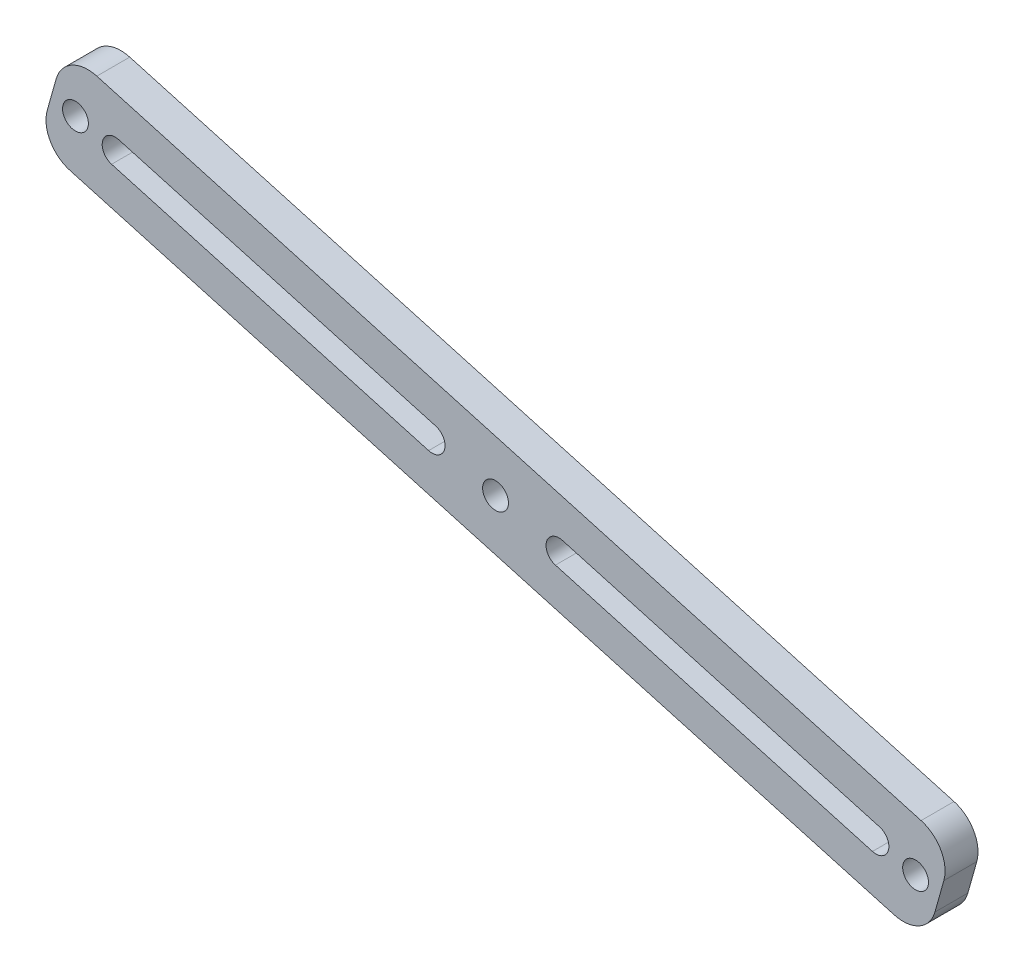
ISO-10303-21;
HEADER;
FILE_DESCRIPTION(('STEP AP214'),'2;1');
FILE_NAME('part.step','',(''),(''),'','','');
FILE_SCHEMA(('AUTOMOTIVE_DESIGN { 1 0 10303 214 1 1 1 1 }'));
ENDSEC;
DATA;
#1=APPLICATION_CONTEXT('core data for automotive mechanical design processes');
#2=APPLICATION_PROTOCOL_DEFINITION('international standard','automotive_design',2000,#1);
#3=PRODUCT_CONTEXT('',#1,'mechanical');
#4=PRODUCT('Part','Part','',(#3));
#5=PRODUCT_RELATED_PRODUCT_CATEGORY('part','',(#4));
#6=PRODUCT_DEFINITION_FORMATION('','',#4);
#7=PRODUCT_DEFINITION_CONTEXT('part definition',#1,'design');
#8=PRODUCT_DEFINITION('design','',#6,#7);
#9=PRODUCT_DEFINITION_SHAPE('','',#8);
#10=(LENGTH_UNIT() NAMED_UNIT(*) SI_UNIT(.MILLI.,.METRE.));
#11=(NAMED_UNIT(*) PLANE_ANGLE_UNIT() SI_UNIT($,.RADIAN.));
#12=(NAMED_UNIT(*) SI_UNIT($,.STERADIAN.) SOLID_ANGLE_UNIT());
#13=UNCERTAINTY_MEASURE_WITH_UNIT(LENGTH_MEASURE(1.E-05),#10,'distance_accuracy_value','');
#14=(GEOMETRIC_REPRESENTATION_CONTEXT(3) GLOBAL_UNCERTAINTY_ASSIGNED_CONTEXT((#13)) GLOBAL_UNIT_ASSIGNED_CONTEXT((#10,
#11,#12)) REPRESENTATION_CONTEXT('',''));
#15=CARTESIAN_POINT('',(0.,0.,0.));
#16=DIRECTION('',(0.,0.,1.));
#17=DIRECTION('',(1.,0.,0.));
#18=AXIS2_PLACEMENT_3D('',#15,#16,#17);
#19=CARTESIAN_POINT('',(156.907108006918,556.114291042661,6.35));
#20=DIRECTION('',(-0.271547306889594,-0.962425093251942,0.));
#21=DIRECTION('',(0.962425093251942,-0.271547306889594,0.));
#22=AXIS2_PLACEMENT_3D('',#19,#20,#21);
#23=PLANE('',#22);
#24=DIRECTION('',(-0.962425093251942,0.271547306889594,0.));
#25=VECTOR('',#24,1.);
#26=CARTESIAN_POINT('',(156.907108006918,556.114291042661,0.));
#27=LINE('',#26,#25);
#28=CARTESIAN_POINT('',(565.111539008492,440.93980663231,0.));
#29=VERTEX_POINT('',#28);
#30=CARTESIAN_POINT('',(406.215156112596,485.772266999782,0.));
#31=VERTEX_POINT('',#30);
#32=EDGE_CURVE('E230',#29,#31,#27,.T.);
#33=ORIENTED_EDGE('',*,*,#32,.F.);
#34=DIRECTION('',(0.,0.,-1.));
#35=VECTOR('',#34,1.);
#36=CARTESIAN_POINT('',(565.111539008492,440.93980663231,6.35));
#37=LINE('',#36,#35);
#38=CARTESIAN_POINT('',(565.111539008492,440.93980663231,6.35));
#39=VERTEX_POINT('',#38);
#40=EDGE_CURVE('E11',#29,#39,#37,.F.);
#41=ORIENTED_EDGE('',*,*,#40,.T.);
#42=DIRECTION('',(-0.962425093251942,0.271547306889594,0.));
#43=VECTOR('',#42,1.);
#44=CARTESIAN_POINT('',(156.907108006918,556.114291042661,6.35));
#45=LINE('',#44,#43);
#46=CARTESIAN_POINT('',(406.215156112596,485.772266999782,6.35));
#47=VERTEX_POINT('',#46);
#48=EDGE_CURVE('E196',#39,#47,#45,.T.);
#49=ORIENTED_EDGE('',*,*,#48,.T.);
#50=DIRECTION('',(0.,0.,-1.));
#51=VECTOR('',#50,1.);
#52=CARTESIAN_POINT('',(406.215156112596,485.772266999782,6.35));
#53=LINE('',#52,#51);
#54=EDGE_CURVE('E47',#47,#31,#53,.T.);
#55=ORIENTED_EDGE('',*,*,#54,.T.);
#56=EDGE_LOOP('',(#33,#41,#49,#55));
#57=FACE_BOUND('',#56,.T.);
#58=ADVANCED_FACE('F39',(#57),#23,.T.);
#59=CARTESIAN_POINT('',(414.315830343723,-116.8988098091,6.35));
#60=DIRECTION('',(-0.962425093251941,0.271547306889595,0.));
#61=DIRECTION('',(-0.271547306889595,-0.962425093251942,0.));
#62=AXIS2_PLACEMENT_3D('',#59,#60,#61);
#63=PLANE('',#62);
#64=DIRECTION('',(0.271547306889595,0.962425093251942,0.));
#65=VECTOR('',#64,1.);
#66=CARTESIAN_POINT('',(414.315830343723,-116.8988098091,0.));
#67=LINE('',#66,#65);
#68=CARTESIAN_POINT('',(572.947263749391,445.326880575711,0.));
#69=VERTEX_POINT('',#68);
#70=CARTESIAN_POINT('',(574.67158914814,451.438279917861,0.));
#71=VERTEX_POINT('',#70);
#72=EDGE_CURVE('E233',#69,#71,#67,.T.);
#73=ORIENTED_EDGE('',*,*,#72,.T.);
#74=DIRECTION('',(0.,0.,-1.));
#75=VECTOR('',#74,1.);
#76=CARTESIAN_POINT('',(574.671589148139,451.438279917861,6.35));
#77=LINE('',#76,#75);
#78=CARTESIAN_POINT('',(574.67158914814,451.438279917861,6.35));
#79=VERTEX_POINT('',#78);
#80=EDGE_CURVE('E54',#71,#79,#77,.F.);
#81=ORIENTED_EDGE('',*,*,#80,.T.);
#82=DIRECTION('',(0.271547306889595,0.962425093251942,0.));
#83=VECTOR('',#82,1.);
#84=CARTESIAN_POINT('',(414.315830343723,-116.8988098091,6.35));
#85=LINE('',#84,#83);
#86=CARTESIAN_POINT('',(572.947263749391,445.326880575711,6.35));
#87=VERTEX_POINT('',#86);
#88=EDGE_CURVE('E199',#87,#79,#85,.T.);
#89=ORIENTED_EDGE('',*,*,#88,.F.);
#90=DIRECTION('',(0.,0.,-1.));
#91=VECTOR('',#90,1.);
#92=CARTESIAN_POINT('',(572.947263749391,445.326880575711,0.));
#93=LINE('',#92,#91);
#94=EDGE_CURVE('E276',#87,#69,#93,.T.);
#95=ORIENTED_EDGE('',*,*,#94,.T.);
#96=EDGE_LOOP('',(#73,#81,#89,#95));
#97=FACE_BOUND('',#96,.T.);
#98=ADVANCED_FACE('F293',(#97),#63,.F.);
#99=CARTESIAN_POINT('',(162.080084203158,574.448489069109,6.35));
#100=DIRECTION('',(0.271547306889585,0.962425093251944,0.));
#101=DIRECTION('',(-0.962425093251944,0.271547306889585,0.));
#102=AXIS2_PLACEMENT_3D('',#99,#100,#101);
#103=PLANE('',#102);
#104=DIRECTION('',(0.962425093251944,-0.271547306889585,0.));
#105=VECTOR('',#104,1.);
#106=CARTESIAN_POINT('',(162.080084203158,574.448489069109,0.));
#107=LINE('',#106,#105);
#108=CARTESIAN_POINT('',(411.388132308842,504.10646502623,0.));
#109=VERTEX_POINT('',#108);
#110=CARTESIAN_POINT('',(570.284515204738,459.27400465876,0.));
#111=VERTEX_POINT('',#110);
#112=EDGE_CURVE('E235',#109,#111,#107,.T.);
#113=ORIENTED_EDGE('',*,*,#112,.F.);
#114=DIRECTION('',(0.,0.,-1.));
#115=VECTOR('',#114,1.);
#116=CARTESIAN_POINT('',(411.388132308842,504.10646502623,6.35));
#117=LINE('',#116,#115);
#118=CARTESIAN_POINT('',(411.388132308842,504.10646502623,6.35));
#119=VERTEX_POINT('',#118);
#120=EDGE_CURVE('E267',#109,#119,#117,.F.);
#121=ORIENTED_EDGE('',*,*,#120,.T.);
#122=DIRECTION('',(0.962425093251944,-0.271547306889585,0.));
#123=VECTOR('',#122,1.);
#124=CARTESIAN_POINT('',(162.080084203158,574.448489069109,6.35));
#125=LINE('',#124,#123);
#126=CARTESIAN_POINT('',(570.284515204738,459.27400465876,6.35));
#127=VERTEX_POINT('',#126);
#128=EDGE_CURVE('E201',#119,#127,#125,.T.);
#129=ORIENTED_EDGE('',*,*,#128,.T.);
#130=DIRECTION('',(0.,0.,-1.));
#131=VECTOR('',#130,1.);
#132=CARTESIAN_POINT('',(570.284515204738,459.27400465876,0.));
#133=LINE('',#132,#131);
#134=EDGE_CURVE('E264',#127,#111,#133,.T.);
#135=ORIENTED_EDGE('',*,*,#134,.T.);
#136=EDGE_LOOP('',(#113,#121,#129,#135));
#137=FACE_BOUND('',#136,.T.);
#138=ADVANCED_FACE('F301',(#137),#103,.T.);
#139=CARTESIAN_POINT('',(500.472634342967,469.074485031773,6.35));
#140=DIRECTION('',(0.,0.,-1.));
#141=DIRECTION('',(-1.,0.,0.));
#142=AXIS2_PLACEMENT_3D('',#139,#140,#141);
#143=CYLINDRICAL_SURFACE('',#142,2.48920000000001);
#144=CARTESIAN_POINT('',(500.472634342967,469.074485031773,0.));
#145=DIRECTION('',(0.,0.,1.));
#146=DIRECTION('',(1.,0.,0.));
#147=AXIS2_PLACEMENT_3D('',#144,#145,#146);
#148=CIRCLE('',#147,2.48920000000001);
#149=CARTESIAN_POINT('',(501.148569899276,471.470153573896,0.));
#150=VERTEX_POINT('',#149);
#151=CARTESIAN_POINT('',(499.796698786657,466.67881648965,0.));
#152=VERTEX_POINT('',#151);
#153=EDGE_CURVE('E218',#150,#152,#148,.T.);
#154=ORIENTED_EDGE('',*,*,#153,.F.);
#155=DIRECTION('',(0.,0.,-1.));
#156=VECTOR('',#155,1.);
#157=CARTESIAN_POINT('',(501.148569899276,471.470153573896,6.35));
#158=LINE('',#157,#156);
#159=CARTESIAN_POINT('',(501.148569899276,471.470153573896,6.35));
#160=VERTEX_POINT('',#159);
#161=EDGE_CURVE('E245',#160,#150,#158,.T.);
#162=ORIENTED_EDGE('',*,*,#161,.F.);
#163=CARTESIAN_POINT('',(500.472634342967,469.074485031773,6.35));
#164=DIRECTION('',(0.,0.,1.));
#165=DIRECTION('',(1.,0.,0.));
#166=AXIS2_PLACEMENT_3D('',#163,#164,#165);
#167=CIRCLE('',#166,2.48920000000001);
#168=CARTESIAN_POINT('',(499.796698786657,466.67881648965,6.35));
#169=VERTEX_POINT('',#168);
#170=EDGE_CURVE('E185',#160,#169,#167,.T.);
#171=ORIENTED_EDGE('',*,*,#170,.T.);
#172=DIRECTION('',(0.,0.,-1.));
#173=VECTOR('',#172,1.);
#174=CARTESIAN_POINT('',(499.796698786657,466.67881648965,6.35));
#175=LINE('',#174,#173);
#176=EDGE_CURVE('E163',#169,#152,#175,.T.);
#177=ORIENTED_EDGE('',*,*,#176,.T.);
#178=EDGE_LOOP('',(#154,#162,#171,#177));
#179=FACE_BOUND('',#178,.T.);
#180=ADVANCED_FACE('F341',(#179),#143,.F.);
#181=CARTESIAN_POINT('',(160.169531661349,567.677058598008,6.35));
#182=DIRECTION('',(-0.271547306889591,-0.962425093251942,0.));
#183=DIRECTION('',(0.962425093251942,-0.271547306889591,0.));
#184=AXIS2_PLACEMENT_3D('',#181,#182,#183);
#185=PLANE('',#184);
#186=DIRECTION('',(-0.962425093251943,0.271547306889591,0.));
#187=VECTOR('',#186,1.);
#188=CARTESIAN_POINT('',(160.169531661349,567.677058598008,0.));
#189=LINE('',#188,#187);
#190=CARTESIAN_POINT('',(562.262563320775,454.226899586407,0.));
#191=VERTEX_POINT('',#190);
#192=EDGE_CURVE('E221',#191,#150,#189,.T.);
#193=ORIENTED_EDGE('',*,*,#192,.F.);
#194=DIRECTION('',(0.,0.,-1.));
#195=VECTOR('',#194,1.);
#196=CARTESIAN_POINT('',(562.262563320775,454.226899586407,6.35));
#197=LINE('',#196,#195);
#198=CARTESIAN_POINT('',(562.262563320775,454.226899586407,6.35));
#199=VERTEX_POINT('',#198);
#200=EDGE_CURVE('E243',#199,#191,#197,.T.);
#201=ORIENTED_EDGE('',*,*,#200,.F.);
#202=DIRECTION('',(-0.962425093251943,0.271547306889591,0.));
#203=VECTOR('',#202,1.);
#204=CARTESIAN_POINT('',(160.169531661349,567.677058598008,6.35));
#205=LINE('',#204,#203);
#206=EDGE_CURVE('E188',#199,#160,#205,.T.);
#207=ORIENTED_EDGE('',*,*,#206,.T.);
#208=ORIENTED_EDGE('',*,*,#161,.T.);
#209=EDGE_LOOP('',(#193,#201,#207,#208));
#210=FACE_BOUND('',#209,.T.);
#211=ADVANCED_FACE('F337',(#210),#185,.T.);
#212=CARTESIAN_POINT('',(561.586627764465,451.831231044284,6.35));
#213=DIRECTION('',(0.,0.,-1.));
#214=DIRECTION('',(-1.,0.,0.));
#215=AXIS2_PLACEMENT_3D('',#212,#213,#214);
#216=CYLINDRICAL_SURFACE('',#215,2.48920000000004);
#217=CARTESIAN_POINT('',(561.586627764465,451.831231044284,0.));
#218=DIRECTION('',(0.,0.,1.));
#219=DIRECTION('',(1.,0.,0.));
#220=AXIS2_PLACEMENT_3D('',#217,#218,#219);
#221=CIRCLE('',#220,2.48920000000004);
#222=CARTESIAN_POINT('',(560.910692208156,449.435562502161,0.));
#223=VERTEX_POINT('',#222);
#224=EDGE_CURVE('E224',#223,#191,#221,.T.);
#225=ORIENTED_EDGE('',*,*,#224,.F.);
#226=DIRECTION('',(0.,0.,-1.));
#227=VECTOR('',#226,1.);
#228=CARTESIAN_POINT('',(560.910692208156,449.435562502161,6.35));
#229=LINE('',#228,#227);
#230=CARTESIAN_POINT('',(560.910692208156,449.435562502161,6.35));
#231=VERTEX_POINT('',#230);
#232=EDGE_CURVE('E241',#231,#223,#229,.T.);
#233=ORIENTED_EDGE('',*,*,#232,.F.);
#234=CARTESIAN_POINT('',(561.586627764465,451.831231044284,6.35));
#235=DIRECTION('',(0.,0.,1.));
#236=DIRECTION('',(1.,0.,0.));
#237=AXIS2_PLACEMENT_3D('',#234,#235,#236);
#238=CIRCLE('',#237,2.48920000000004);
#239=EDGE_CURVE('E191',#231,#199,#238,.T.);
#240=ORIENTED_EDGE('',*,*,#239,.T.);
#241=ORIENTED_EDGE('',*,*,#200,.T.);
#242=EDGE_LOOP('',(#225,#233,#240,#241));
#243=FACE_BOUND('',#242,.T.);
#244=ADVANCED_FACE('F334',(#243),#216,.F.);
#245=CARTESIAN_POINT('',(476.027036974368,475.971786626769,6.35));
#246=DIRECTION('',(0.,0.,-1.));
#247=DIRECTION('',(-1.,0.,0.));
#248=AXIS2_PLACEMENT_3D('',#245,#246,#247);
#249=CYLINDRICAL_SURFACE('',#248,2.48919999999999);
#250=CARTESIAN_POINT('',(476.027036974368,475.971786626769,0.));
#251=DIRECTION('',(0.,0.,1.));
#252=DIRECTION('',(1.,0.,0.));
#253=AXIS2_PLACEMENT_3D('',#250,#251,#252);
#254=CIRCLE('',#253,2.48919999999999);
#255=CARTESIAN_POINT('',(475.351101418058,473.576118084646,0.));
#256=VERTEX_POINT('',#255);
#257=CARTESIAN_POINT('',(476.702972530677,478.367455168892,0.));
#258=VERTEX_POINT('',#257);
#259=EDGE_CURVE('E158',#256,#258,#254,.T.);
#260=ORIENTED_EDGE('',*,*,#259,.F.);
#261=DIRECTION('',(0.,0.,-1.));
#262=VECTOR('',#261,1.);
#263=CARTESIAN_POINT('',(475.351101418058,473.576118084646,6.35));
#264=LINE('',#263,#262);
#265=CARTESIAN_POINT('',(475.351101418058,473.576118084646,6.35));
#266=VERTEX_POINT('',#265);
#267=EDGE_CURVE('E153',#266,#256,#264,.T.);
#268=ORIENTED_EDGE('',*,*,#267,.F.);
#269=CARTESIAN_POINT('',(476.027036974368,475.971786626769,6.35));
#270=DIRECTION('',(0.,0.,1.));
#271=DIRECTION('',(1.,0.,0.));
#272=AXIS2_PLACEMENT_3D('',#269,#270,#271);
#273=CIRCLE('',#272,2.48919999999999);
#274=CARTESIAN_POINT('',(476.702972530677,478.367455168892,6.35));
#275=VERTEX_POINT('',#274);
#276=EDGE_CURVE('E156',#266,#275,#273,.T.);
#277=ORIENTED_EDGE('',*,*,#276,.T.);
#278=DIRECTION('',(0.,0.,-1.));
#279=VECTOR('',#278,1.);
#280=CARTESIAN_POINT('',(476.702972530677,478.367455168892,6.35));
#281=LINE('',#280,#279);
#282=EDGE_CURVE('E207',#275,#258,#281,.T.);
#283=ORIENTED_EDGE('',*,*,#282,.T.);
#284=EDGE_LOOP('',(#260,#268,#277,#283));
#285=FACE_BOUND('',#284,.T.);
#286=ADVANCED_FACE('F155',(#285),#249,.F.);
#287=CARTESIAN_POINT('',(158.817660548732,562.885721513763,6.35));
#288=DIRECTION('',(0.271547306889594,0.962425093251942,0.));
#289=DIRECTION('',(-0.962425093251942,0.271547306889594,0.));
#290=AXIS2_PLACEMENT_3D('',#287,#288,#289);
#291=PLANE('',#290);
#292=DIRECTION('',(0.962425093251942,-0.271547306889594,0.));
#293=VECTOR('',#292,1.);
#294=CARTESIAN_POINT('',(158.817660548732,562.885721513763,0.));
#295=LINE('',#294,#293);
#296=CARTESIAN_POINT('',(414.23710799656,490.819372072135,0.));
#297=VERTEX_POINT('',#296);
#298=EDGE_CURVE('E209',#297,#256,#295,.T.);
#299=ORIENTED_EDGE('',*,*,#298,.F.);
#300=DIRECTION('',(0.,0.,-1.));
#301=VECTOR('',#300,1.);
#302=CARTESIAN_POINT('',(414.23710799656,490.819372072135,6.35));
#303=LINE('',#302,#301);
#304=CARTESIAN_POINT('',(414.23710799656,490.819372072135,6.35));
#305=VERTEX_POINT('',#304);
#306=EDGE_CURVE('E164',#305,#297,#303,.T.);
#307=ORIENTED_EDGE('',*,*,#306,.F.);
#308=DIRECTION('',(0.962425093251942,-0.271547306889594,0.));
#309=VECTOR('',#308,1.);
#310=CARTESIAN_POINT('',(158.817660548732,562.885721513763,6.35));
#311=LINE('',#310,#309);
#312=EDGE_CURVE('E171',#305,#266,#311,.T.);
#313=ORIENTED_EDGE('',*,*,#312,.T.);
#314=ORIENTED_EDGE('',*,*,#267,.T.);
#315=EDGE_LOOP('',(#299,#307,#313,#314));
#316=FACE_BOUND('',#315,.T.);
#317=ADVANCED_FACE('F178',(#316),#291,.T.);
#318=CARTESIAN_POINT('',(414.913043552869,493.215040614258,6.35));
#319=DIRECTION('',(0.,0.,-1.));
#320=DIRECTION('',(-1.,0.,0.));
#321=AXIS2_PLACEMENT_3D('',#318,#319,#320);
#322=CYLINDRICAL_SURFACE('',#321,2.48919999999999);
#323=CARTESIAN_POINT('',(414.913043552869,493.215040614258,0.));
#324=DIRECTION('',(0.,0.,1.));
#325=DIRECTION('',(1.,0.,0.));
#326=AXIS2_PLACEMENT_3D('',#323,#324,#325);
#327=CIRCLE('',#326,2.48919999999999);
#328=CARTESIAN_POINT('',(415.588979109179,495.610709156381,0.));
#329=VERTEX_POINT('',#328);
#330=EDGE_CURVE('E212',#329,#297,#327,.T.);
#331=ORIENTED_EDGE('',*,*,#330,.F.);
#332=DIRECTION('',(0.,0.,-1.));
#333=VECTOR('',#332,1.);
#334=CARTESIAN_POINT('',(415.588979109179,495.610709156381,6.35));
#335=LINE('',#334,#333);
#336=CARTESIAN_POINT('',(415.588979109179,495.610709156381,6.35));
#337=VERTEX_POINT('',#336);
#338=EDGE_CURVE('E249',#337,#329,#335,.T.);
#339=ORIENTED_EDGE('',*,*,#338,.F.);
#340=CARTESIAN_POINT('',(414.913043552869,493.215040614258,6.35));
#341=DIRECTION('',(0.,0.,1.));
#342=DIRECTION('',(1.,0.,0.));
#343=AXIS2_PLACEMENT_3D('',#340,#341,#342);
#344=CIRCLE('',#343,2.48919999999999);
#345=EDGE_CURVE('E179',#337,#305,#344,.T.);
#346=ORIENTED_EDGE('',*,*,#345,.T.);
#347=ORIENTED_EDGE('',*,*,#306,.T.);
#348=EDGE_LOOP('',(#331,#339,#346,#347));
#349=FACE_BOUND('',#348,.T.);
#350=ADVANCED_FACE('F332',(#349),#322,.F.);
#351=CARTESIAN_POINT('',(158.817660548731,562.885721513763,6.35));
#352=DIRECTION('',(-0.271547306889592,-0.962425093251942,0.));
#353=DIRECTION('',(0.962425093251942,-0.271547306889592,0.));
#354=AXIS2_PLACEMENT_3D('',#351,#352,#353);
#355=PLANE('',#354);
#356=DIRECTION('',(-0.962425093251942,0.271547306889592,0.));
#357=VECTOR('',#356,1.);
#358=CARTESIAN_POINT('',(158.817660548731,562.885721513763,0.));
#359=LINE('',#358,#357);
#360=EDGE_CURVE('E227',#223,#152,#359,.T.);
#361=ORIENTED_EDGE('',*,*,#360,.T.);
#362=ORIENTED_EDGE('',*,*,#176,.F.);
#363=DIRECTION('',(-0.962425093251942,0.271547306889592,0.));
#364=VECTOR('',#363,1.);
#365=CARTESIAN_POINT('',(158.817660548731,562.885721513763,6.35));
#366=LINE('',#365,#364);
#367=EDGE_CURVE('E194',#231,#169,#366,.T.);
#368=ORIENTED_EDGE('',*,*,#367,.F.);
#369=ORIENTED_EDGE('',*,*,#232,.T.);
#370=EDGE_LOOP('',(#361,#362,#368,#369));
#371=FACE_BOUND('',#370,.T.);
#372=ADVANCED_FACE('F328',(#371),#355,.F.);
#373=CARTESIAN_POINT('',(160.169531661351,567.677058598009,6.35));
#374=DIRECTION('',(0.271547306889594,0.962425093251942,0.));
#375=DIRECTION('',(-0.962425093251942,0.271547306889594,0.));
#376=AXIS2_PLACEMENT_3D('',#373,#374,#375);
#377=PLANE('',#376);
#378=DIRECTION('',(0.962425093251942,-0.271547306889594,0.));
#379=VECTOR('',#378,1.);
#380=CARTESIAN_POINT('',(160.169531661351,567.677058598009,0.));
#381=LINE('',#380,#379);
#382=EDGE_CURVE('E215',#329,#258,#381,.T.);
#383=ORIENTED_EDGE('',*,*,#382,.T.);
#384=ORIENTED_EDGE('',*,*,#282,.F.);
#385=DIRECTION('',(0.962425093251942,-0.271547306889594,0.));
#386=VECTOR('',#385,1.);
#387=CARTESIAN_POINT('',(160.169531661351,567.677058598009,6.35));
#388=LINE('',#387,#386);
#389=EDGE_CURVE('E174',#337,#275,#388,.T.);
#390=ORIENTED_EDGE('',*,*,#389,.F.);
#391=ORIENTED_EDGE('',*,*,#338,.T.);
#392=EDGE_LOOP('',(#383,#384,#390,#391));
#393=FACE_BOUND('',#392,.T.);
#394=ADVANCED_FACE('F331',(#393),#377,.F.);
#395=CARTESIAN_POINT('',(243.196648763529,-68.6176986441301,6.35));
#396=DIRECTION('',(-0.962425093251942,0.271547306889593,0.));
#397=DIRECTION('',(-0.271547306889593,-0.962425093251942,0.));
#398=AXIS2_PLACEMENT_3D('',#395,#396,#397);
#399=PLANE('',#398);
#400=DIRECTION('',(0.271547306889593,0.962425093251942,0.));
#401=VECTOR('',#400,1.);
#402=CARTESIAN_POINT('',(243.196648763529,-68.6176986441301,6.35));
#403=LINE('',#402,#401);
#404=CARTESIAN_POINT('',(401.828082169195,493.607991740681,6.35));
#405=VERTEX_POINT('',#404);
#406=CARTESIAN_POINT('',(403.552407567944,499.719391082829,6.35));
#407=VERTEX_POINT('',#406);
#408=EDGE_CURVE('E204',#405,#407,#403,.T.);
#409=ORIENTED_EDGE('',*,*,#408,.T.);
#410=DIRECTION('',(0.,0.,-1.));
#411=VECTOR('',#410,1.);
#412=CARTESIAN_POINT('',(403.552407567944,499.719391082829,6.35));
#413=LINE('',#412,#411);
#414=CARTESIAN_POINT('',(403.552407567944,499.719391082829,0.));
#415=VERTEX_POINT('',#414);
#416=EDGE_CURVE('E253',#407,#415,#413,.T.);
#417=ORIENTED_EDGE('',*,*,#416,.T.);
#418=DIRECTION('',(0.271547306889593,0.962425093251942,0.));
#419=VECTOR('',#418,1.);
#420=CARTESIAN_POINT('',(243.196648763529,-68.6176986441301,0.));
#421=LINE('',#420,#419);
#422=CARTESIAN_POINT('',(401.828082169195,493.607991740681,0.));
#423=VERTEX_POINT('',#422);
#424=EDGE_CURVE('E176',#423,#415,#421,.T.);
#425=ORIENTED_EDGE('',*,*,#424,.F.);
#426=DIRECTION('',(0.,0.,-1.));
#427=VECTOR('',#426,1.);
#428=CARTESIAN_POINT('',(401.828082169195,493.607991740681,6.35));
#429=LINE('',#428,#427);
#430=EDGE_CURVE('E247',#423,#405,#429,.F.);
#431=ORIENTED_EDGE('',*,*,#430,.T.);
#432=EDGE_LOOP('',(#409,#417,#425,#431));
#433=FACE_BOUND('',#432,.T.);
#434=ADVANCED_FACE('F308',(#433),#399,.T.);
#435=CARTESIAN_POINT('',(0.,0.,6.35));
#436=DIRECTION('',(0.,0.,1.));
#437=DIRECTION('',(1.,0.,0.));
#438=AXIS2_PLACEMENT_3D('',#435,#436,#437);
#439=PLANE('',#438);
#440=CARTESIAN_POINT('',(407.273794375182,495.370447362694,6.35));
#441=DIRECTION('',(0.,0.,1.));
#442=DIRECTION('',(1.,0.,0.));
#443=AXIS2_PLACEMENT_3D('',#440,#441,#442);
#444=CIRCLE('',#443,2.48920000000001);
#445=CARTESIAN_POINT('',(409.762994375182,495.370447362694,6.35));
#446=VERTEX_POINT('',#445);
#447=EDGE_CURVE('E554',#446,#446,#444,.T.);
#448=ORIENTED_EDGE('',*,*,#447,.F.);
#449=EDGE_LOOP('',(#448));
#450=FACE_BOUND('',#449,.T.);
#451=CARTESIAN_POINT('',(569.225876942153,449.675824295848,6.35));
#452=DIRECTION('',(0.,0.,1.));
#453=DIRECTION('',(1.,0.,0.));
#454=AXIS2_PLACEMENT_3D('',#451,#452,#453);
#455=CIRCLE('',#454,2.48919999999995);
#456=CARTESIAN_POINT('',(571.715076942153,449.675824295848,6.35));
#457=VERTEX_POINT('',#456);
#458=EDGE_CURVE('E558',#457,#457,#455,.T.);
#459=ORIENTED_EDGE('',*,*,#458,.F.);
#460=EDGE_LOOP('',(#459));
#461=FACE_BOUND('',#460,.T.);
#462=CARTESIAN_POINT('',(488.249835658667,472.523135829271,6.35));
#463=DIRECTION('',(0.,0.,1.));
#464=DIRECTION('',(1.,0.,0.));
#465=AXIS2_PLACEMENT_3D('',#462,#463,#464);
#466=CIRCLE('',#465,2.48920000000001);
#467=CARTESIAN_POINT('',(490.739035658667,472.523135829271,6.35));
#468=VERTEX_POINT('',#467);
#469=EDGE_CURVE('E564',#468,#468,#466,.T.);
#470=ORIENTED_EDGE('',*,*,#469,.F.);
#471=EDGE_LOOP('',(#470));
#472=FACE_BOUND('',#471,.T.);
#473=ORIENTED_EDGE('',*,*,#276,.F.);
#474=ORIENTED_EDGE('',*,*,#312,.F.);
#475=ORIENTED_EDGE('',*,*,#345,.F.);
#476=ORIENTED_EDGE('',*,*,#389,.T.);
#477=EDGE_LOOP('',(#473,#474,#475,#476));
#478=FACE_BOUND('',#477,.T.);
#479=ORIENTED_EDGE('',*,*,#170,.F.);
#480=ORIENTED_EDGE('',*,*,#206,.F.);
#481=ORIENTED_EDGE('',*,*,#239,.F.);
#482=ORIENTED_EDGE('',*,*,#367,.T.);
#483=EDGE_LOOP('',(#479,#480,#481,#482));
#484=FACE_BOUND('',#483,.T.);
#485=ORIENTED_EDGE('',*,*,#128,.F.);
#486=CARTESIAN_POINT('',(409.663806910094,497.99506568408,6.35));
#487=DIRECTION('',(0.,0.,1.));
#488=DIRECTION('',(1.,0.,0.));
#489=AXIS2_PLACEMENT_3D('',#486,#487,#488);
#490=CIRCLE('',#489,6.35);
#491=EDGE_CURVE('E274',#119,#407,#490,.T.);
#492=ORIENTED_EDGE('',*,*,#491,.T.);
#493=ORIENTED_EDGE('',*,*,#408,.F.);
#494=CARTESIAN_POINT('',(407.939481511345,491.883666341932,6.35));
#495=DIRECTION('',(0.,0.,1.));
#496=DIRECTION('',(1.,0.,0.));
#497=AXIS2_PLACEMENT_3D('',#494,#495,#496);
#498=CIRCLE('',#497,6.35);
#499=EDGE_CURVE('E269',#405,#47,#498,.T.);
#500=ORIENTED_EDGE('',*,*,#499,.T.);
#501=ORIENTED_EDGE('',*,*,#48,.F.);
#502=CARTESIAN_POINT('',(566.835864407241,447.05120597446,6.35));
#503=DIRECTION('',(0.,0.,1.));
#504=DIRECTION('',(1.,0.,0.));
#505=AXIS2_PLACEMENT_3D('',#502,#503,#504);
#506=CIRCLE('',#505,6.35);
#507=EDGE_CURVE('E61',#39,#87,#506,.T.);
#508=ORIENTED_EDGE('',*,*,#507,.T.);
#509=ORIENTED_EDGE('',*,*,#88,.T.);
#510=CARTESIAN_POINT('',(568.56018980599,453.16260531661,6.35));
#511=DIRECTION('',(0.,0.,1.));
#512=DIRECTION('',(1.,0.,0.));
#513=AXIS2_PLACEMENT_3D('',#510,#511,#512);
#514=CIRCLE('',#513,6.35);
#515=EDGE_CURVE('E272',#79,#127,#514,.T.);
#516=ORIENTED_EDGE('',*,*,#515,.T.);
#517=EDGE_LOOP('',(#485,#492,#493,#500,#501,#508,#509,#516));
#518=FACE_BOUND('',#517,.T.);
#519=ADVANCED_FACE('F168',(#450,#461,#472,#478,#484,#518),#439,.T.);
#520=CARTESIAN_POINT('',(0.,0.,0.));
#521=DIRECTION('',(0.,0.,1.));
#522=DIRECTION('',(1.,0.,0.));
#523=AXIS2_PLACEMENT_3D('',#520,#521,#522);
#524=PLANE('',#523);
#525=CARTESIAN_POINT('',(407.273794375182,495.370447362694,0.));
#526=DIRECTION('',(0.,0.,1.));
#527=DIRECTION('',(1.,0.,0.));
#528=AXIS2_PLACEMENT_3D('',#525,#526,#527);
#529=CIRCLE('',#528,2.48920000000001);
#530=CARTESIAN_POINT('',(409.762994375182,495.370447362694,0.));
#531=VERTEX_POINT('',#530);
#532=EDGE_CURVE('E551',#531,#531,#529,.T.);
#533=ORIENTED_EDGE('',*,*,#532,.T.);
#534=EDGE_LOOP('',(#533));
#535=FACE_BOUND('',#534,.T.);
#536=CARTESIAN_POINT('',(569.225876942153,449.675824295848,0.));
#537=DIRECTION('',(0.,0.,1.));
#538=DIRECTION('',(1.,0.,0.));
#539=AXIS2_PLACEMENT_3D('',#536,#537,#538);
#540=CIRCLE('',#539,2.48919999999995);
#541=CARTESIAN_POINT('',(571.715076942153,449.675824295848,0.));
#542=VERTEX_POINT('',#541);
#543=EDGE_CURVE('E555',#542,#542,#540,.T.);
#544=ORIENTED_EDGE('',*,*,#543,.T.);
#545=EDGE_LOOP('',(#544));
#546=FACE_BOUND('',#545,.T.);
#547=CARTESIAN_POINT('',(488.249835658667,472.523135829271,0.));
#548=DIRECTION('',(0.,0.,1.));
#549=DIRECTION('',(1.,0.,0.));
#550=AXIS2_PLACEMENT_3D('',#547,#548,#549);
#551=CIRCLE('',#550,2.48920000000001);
#552=CARTESIAN_POINT('',(490.739035658667,472.523135829271,0.));
#553=VERTEX_POINT('',#552);
#554=EDGE_CURVE('E210',#553,#553,#551,.T.);
#555=ORIENTED_EDGE('',*,*,#554,.T.);
#556=EDGE_LOOP('',(#555));
#557=FACE_BOUND('',#556,.T.);
#558=ORIENTED_EDGE('',*,*,#259,.T.);
#559=ORIENTED_EDGE('',*,*,#382,.F.);
#560=ORIENTED_EDGE('',*,*,#330,.T.);
#561=ORIENTED_EDGE('',*,*,#298,.T.);
#562=EDGE_LOOP('',(#558,#559,#560,#561));
#563=FACE_BOUND('',#562,.T.);
#564=ORIENTED_EDGE('',*,*,#153,.T.);
#565=ORIENTED_EDGE('',*,*,#360,.F.);
#566=ORIENTED_EDGE('',*,*,#224,.T.);
#567=ORIENTED_EDGE('',*,*,#192,.T.);
#568=EDGE_LOOP('',(#564,#565,#566,#567));
#569=FACE_BOUND('',#568,.T.);
#570=ORIENTED_EDGE('',*,*,#424,.T.);
#571=CARTESIAN_POINT('',(409.663806910094,497.99506568408,0.));
#572=DIRECTION('',(0.,0.,1.));
#573=DIRECTION('',(1.,0.,0.));
#574=AXIS2_PLACEMENT_3D('',#571,#572,#573);
#575=CIRCLE('',#574,6.35);
#576=EDGE_CURVE('E262',#415,#109,#575,.F.);
#577=ORIENTED_EDGE('',*,*,#576,.T.);
#578=ORIENTED_EDGE('',*,*,#112,.T.);
#579=CARTESIAN_POINT('',(568.56018980599,453.16260531661,0.));
#580=DIRECTION('',(0.,0.,1.));
#581=DIRECTION('',(1.,0.,0.));
#582=AXIS2_PLACEMENT_3D('',#579,#580,#581);
#583=CIRCLE('',#582,6.35);
#584=EDGE_CURVE('E260',#111,#71,#583,.F.);
#585=ORIENTED_EDGE('',*,*,#584,.T.);
#586=ORIENTED_EDGE('',*,*,#72,.F.);
#587=CARTESIAN_POINT('',(566.835864407241,447.05120597446,0.));
#588=DIRECTION('',(0.,0.,1.));
#589=DIRECTION('',(1.,0.,0.));
#590=AXIS2_PLACEMENT_3D('',#587,#588,#589);
#591=CIRCLE('',#590,6.35);
#592=EDGE_CURVE('E258',#69,#29,#591,.F.);
#593=ORIENTED_EDGE('',*,*,#592,.T.);
#594=ORIENTED_EDGE('',*,*,#32,.T.);
#595=CARTESIAN_POINT('',(407.939481511345,491.883666341932,0.));
#596=DIRECTION('',(0.,0.,1.));
#597=DIRECTION('',(1.,0.,0.));
#598=AXIS2_PLACEMENT_3D('',#595,#596,#597);
#599=CIRCLE('',#598,6.35);
#600=EDGE_CURVE('E256',#31,#423,#599,.F.);
#601=ORIENTED_EDGE('',*,*,#600,.T.);
#602=EDGE_LOOP('',(#570,#577,#578,#585,#586,#593,#594,#601));
#603=FACE_BOUND('',#602,.T.);
#604=ADVANCED_FACE('F287',(#535,#546,#557,#563,#569,#603),#524,.F.);
#605=CARTESIAN_POINT('',(409.663806910094,497.99506568408,6.35));
#606=DIRECTION('',(0.,0.,-1.));
#607=DIRECTION('',(-1.,0.,0.));
#608=AXIS2_PLACEMENT_3D('',#605,#606,#607);
#609=CYLINDRICAL_SURFACE('',#608,6.35);
#610=ORIENTED_EDGE('',*,*,#491,.F.);
#611=ORIENTED_EDGE('',*,*,#120,.F.);
#612=ORIENTED_EDGE('',*,*,#576,.F.);
#613=ORIENTED_EDGE('',*,*,#416,.F.);
#614=EDGE_LOOP('',(#610,#611,#612,#613));
#615=FACE_BOUND('',#614,.T.);
#616=ADVANCED_FACE('F306',(#615),#609,.T.);
#617=CARTESIAN_POINT('',(568.56018980599,453.16260531661,6.35));
#618=DIRECTION('',(0.,0.,1.));
#619=DIRECTION('',(1.,0.,0.));
#620=AXIS2_PLACEMENT_3D('',#617,#618,#619);
#621=CYLINDRICAL_SURFACE('',#620,6.35);
#622=ORIENTED_EDGE('',*,*,#515,.F.);
#623=ORIENTED_EDGE('',*,*,#80,.F.);
#624=ORIENTED_EDGE('',*,*,#584,.F.);
#625=ORIENTED_EDGE('',*,*,#134,.F.);
#626=EDGE_LOOP('',(#622,#623,#624,#625));
#627=FACE_BOUND('',#626,.T.);
#628=ADVANCED_FACE('F298',(#627),#621,.T.);
#629=CARTESIAN_POINT('',(566.835864407241,447.05120597446,6.35));
#630=DIRECTION('',(0.,0.,1.));
#631=DIRECTION('',(1.,0.,0.));
#632=AXIS2_PLACEMENT_3D('',#629,#630,#631);
#633=CYLINDRICAL_SURFACE('',#632,6.35);
#634=ORIENTED_EDGE('',*,*,#507,.F.);
#635=ORIENTED_EDGE('',*,*,#40,.F.);
#636=ORIENTED_EDGE('',*,*,#592,.F.);
#637=ORIENTED_EDGE('',*,*,#94,.F.);
#638=EDGE_LOOP('',(#634,#635,#636,#637));
#639=FACE_BOUND('',#638,.T.);
#640=ADVANCED_FACE('F292',(#639),#633,.T.);
#641=CARTESIAN_POINT('',(407.939481511345,491.883666341932,6.35));
#642=DIRECTION('',(0.,0.,-1.));
#643=DIRECTION('',(-1.,0.,0.));
#644=AXIS2_PLACEMENT_3D('',#641,#642,#643);
#645=CYLINDRICAL_SURFACE('',#644,6.35);
#646=ORIENTED_EDGE('',*,*,#499,.F.);
#647=ORIENTED_EDGE('',*,*,#430,.F.);
#648=ORIENTED_EDGE('',*,*,#600,.F.);
#649=ORIENTED_EDGE('',*,*,#54,.F.);
#650=EDGE_LOOP('',(#646,#647,#648,#649));
#651=FACE_BOUND('',#650,.T.);
#652=ADVANCED_FACE('F41',(#651),#645,.T.);
#653=CARTESIAN_POINT('',(488.249835658667,472.523135829271,0.));
#654=DIRECTION('',(0.,0.,1.));
#655=DIRECTION('',(1.,0.,0.));
#656=AXIS2_PLACEMENT_3D('',#653,#654,#655);
#657=CYLINDRICAL_SURFACE('',#656,2.48920000000001);
#658=ORIENTED_EDGE('',*,*,#554,.F.);
#659=EDGE_LOOP('',(#658));
#660=FACE_BOUND('',#659,.T.);
#661=ORIENTED_EDGE('',*,*,#469,.T.);
#662=EDGE_LOOP('',(#661));
#663=FACE_BOUND('',#662,.T.);
#664=ADVANCED_FACE('F312',(#660,#663),#657,.F.);
#665=CARTESIAN_POINT('',(569.225876942153,449.675824295848,0.));
#666=DIRECTION('',(0.,0.,1.));
#667=DIRECTION('',(1.,0.,0.));
#668=AXIS2_PLACEMENT_3D('',#665,#666,#667);
#669=CYLINDRICAL_SURFACE('',#668,2.48919999999995);
#670=ORIENTED_EDGE('',*,*,#543,.F.);
#671=EDGE_LOOP('',(#670));
#672=FACE_BOUND('',#671,.T.);
#673=ORIENTED_EDGE('',*,*,#458,.T.);
#674=EDGE_LOOP('',(#673));
#675=FACE_BOUND('',#674,.T.);
#676=ADVANCED_FACE('F317',(#672,#675),#669,.F.);
#677=CARTESIAN_POINT('',(407.273794375182,495.370447362694,0.));
#678=DIRECTION('',(0.,0.,1.));
#679=DIRECTION('',(1.,0.,0.));
#680=AXIS2_PLACEMENT_3D('',#677,#678,#679);
#681=CYLINDRICAL_SURFACE('',#680,2.48920000000001);
#682=ORIENTED_EDGE('',*,*,#532,.F.);
#683=EDGE_LOOP('',(#682));
#684=FACE_BOUND('',#683,.T.);
#685=ORIENTED_EDGE('',*,*,#447,.T.);
#686=EDGE_LOOP('',(#685));
#687=FACE_BOUND('',#686,.T.);
#688=ADVANCED_FACE('F412',(#684,#687),#681,.F.);
#689=CLOSED_SHELL('',(#58,#98,#138,#180,#211,#244,#286,#317,#350,#372,#394,#434,#519,#604,#616,
#628,#640,#652,#664,#676,#688));
#690=MANIFOLD_SOLID_BREP('B2',#689);
#691=ADVANCED_BREP_SHAPE_REPRESENTATION('',(#18,#690),#14);
#692=SHAPE_DEFINITION_REPRESENTATION(#9,#691);
ENDSEC;
END-ISO-10303-21;
